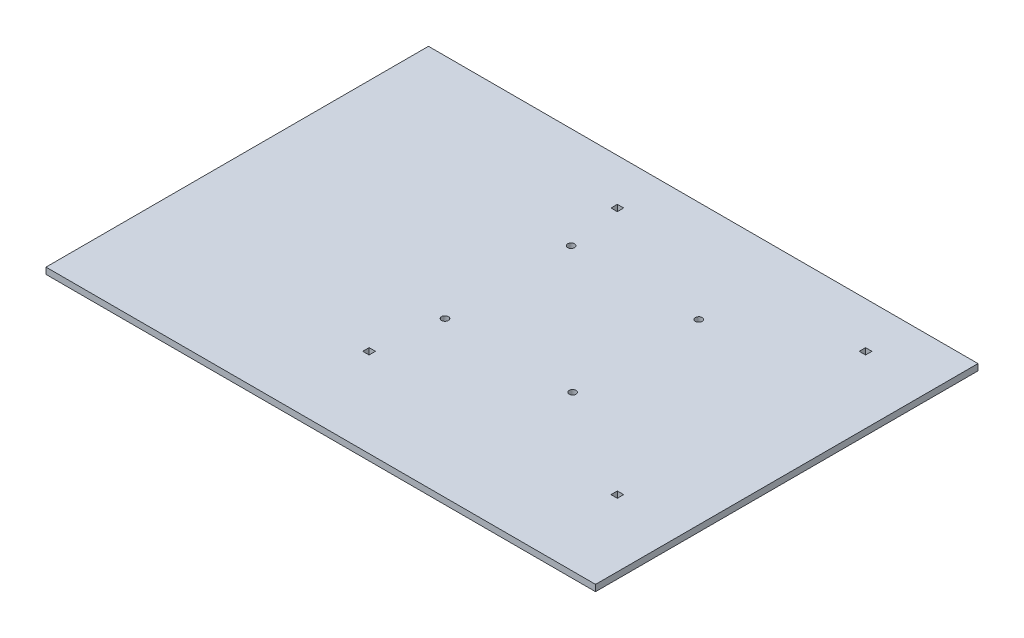
ISO-10303-21;
HEADER;
FILE_DESCRIPTION(('STEP AP214'),'2;1');
FILE_NAME('part.step','',(''),(''),'','','');
FILE_SCHEMA(('AUTOMOTIVE_DESIGN { 1 0 10303 214 1 1 1 1 }'));
ENDSEC;
DATA;
#1=APPLICATION_CONTEXT('core data for automotive mechanical design processes');
#2=APPLICATION_PROTOCOL_DEFINITION('international standard','automotive_design',2000,#1);
#3=PRODUCT_CONTEXT('',#1,'mechanical');
#4=PRODUCT('Part','Part','',(#3));
#5=PRODUCT_RELATED_PRODUCT_CATEGORY('part','',(#4));
#6=PRODUCT_DEFINITION_FORMATION('','',#4);
#7=PRODUCT_DEFINITION_CONTEXT('part definition',#1,'design');
#8=PRODUCT_DEFINITION('design','',#6,#7);
#9=PRODUCT_DEFINITION_SHAPE('','',#8);
#10=(LENGTH_UNIT() NAMED_UNIT(*) SI_UNIT(.MILLI.,.METRE.));
#11=(NAMED_UNIT(*) PLANE_ANGLE_UNIT() SI_UNIT($,.RADIAN.));
#12=(NAMED_UNIT(*) SI_UNIT($,.STERADIAN.) SOLID_ANGLE_UNIT());
#13=UNCERTAINTY_MEASURE_WITH_UNIT(LENGTH_MEASURE(1.E-05),#10,'distance_accuracy_value','');
#14=(GEOMETRIC_REPRESENTATION_CONTEXT(3) GLOBAL_UNCERTAINTY_ASSIGNED_CONTEXT((#13)) GLOBAL_UNIT_ASSIGNED_CONTEXT((#10,
#11,#12)) REPRESENTATION_CONTEXT('',''));
#15=CARTESIAN_POINT('',(0.,0.,0.));
#16=DIRECTION('',(0.,0.,1.));
#17=DIRECTION('',(1.,0.,0.));
#18=AXIS2_PLACEMENT_3D('',#15,#16,#17);
#19=CARTESIAN_POINT('',(0.,0.,0.));
#20=DIRECTION('',(0.,-1.,0.));
#21=DIRECTION('',(0.,0.,-1.));
#22=AXIS2_PLACEMENT_3D('',#19,#20,#21);
#23=PLANE('',#22);
#24=DIRECTION('',(-1.,0.,0.));
#25=VECTOR('',#24,1.);
#26=CARTESIAN_POINT('',(60.,0.,57.));
#27=LINE('',#26,#25);
#28=CARTESIAN_POINT('',(60.,0.,57.));
#29=VERTEX_POINT('',#28);
#30=CARTESIAN_POINT('',(57.,0.,57.));
#31=VERTEX_POINT('',#30);
#32=EDGE_CURVE('E225',#29,#31,#27,.T.);
#33=ORIENTED_EDGE('',*,*,#32,.T.);
#34=DIRECTION('',(0.,0.,-1.));
#35=VECTOR('',#34,1.);
#36=CARTESIAN_POINT('',(57.,0.,60.));
#37=LINE('',#36,#35);
#38=CARTESIAN_POINT('',(57.,0.,60.));
#39=VERTEX_POINT('',#38);
#40=EDGE_CURVE('E238',#39,#31,#37,.T.);
#41=ORIENTED_EDGE('',*,*,#40,.F.);
#42=DIRECTION('',(-1.,0.,0.));
#43=VECTOR('',#42,1.);
#44=CARTESIAN_POINT('',(60.,0.,60.));
#45=LINE('',#44,#43);
#46=CARTESIAN_POINT('',(60.,0.,60.));
#47=VERTEX_POINT('',#46);
#48=EDGE_CURVE('E236',#47,#39,#45,.T.);
#49=ORIENTED_EDGE('',*,*,#48,.F.);
#50=DIRECTION('',(0.,0.,-1.));
#51=VECTOR('',#50,1.);
#52=CARTESIAN_POINT('',(60.,0.,60.));
#53=LINE('',#52,#51);
#54=EDGE_CURVE('E214',#47,#29,#53,.T.);
#55=ORIENTED_EDGE('',*,*,#54,.T.);
#56=EDGE_LOOP('',(#33,#41,#49,#55));
#57=FACE_BOUND('',#56,.T.);
#58=DIRECTION('',(1.,0.,0.));
#59=VECTOR('',#58,1.);
#60=CARTESIAN_POINT('',(-60.,0.,-57.));
#61=LINE('',#60,#59);
#62=CARTESIAN_POINT('',(-60.,0.,-57.));
#63=VERTEX_POINT('',#62);
#64=CARTESIAN_POINT('',(-57.,0.,-57.));
#65=VERTEX_POINT('',#64);
#66=EDGE_CURVE('E270',#63,#65,#61,.T.);
#67=ORIENTED_EDGE('',*,*,#66,.T.);
#68=DIRECTION('',(0.,0.,1.));
#69=VECTOR('',#68,1.);
#70=CARTESIAN_POINT('',(-57.,0.,-60.));
#71=LINE('',#70,#69);
#72=CARTESIAN_POINT('',(-57.,0.,-60.));
#73=VERTEX_POINT('',#72);
#74=EDGE_CURVE('E273',#73,#65,#71,.T.);
#75=ORIENTED_EDGE('',*,*,#74,.F.);
#76=DIRECTION('',(1.,0.,0.));
#77=VECTOR('',#76,1.);
#78=CARTESIAN_POINT('',(-60.,0.,-60.));
#79=LINE('',#78,#77);
#80=CARTESIAN_POINT('',(-60.,0.,-60.));
#81=VERTEX_POINT('',#80);
#82=EDGE_CURVE('E276',#81,#73,#79,.T.);
#83=ORIENTED_EDGE('',*,*,#82,.F.);
#84=DIRECTION('',(0.,0.,1.));
#85=VECTOR('',#84,1.);
#86=CARTESIAN_POINT('',(-60.,0.,-60.));
#87=LINE('',#86,#85);
#88=EDGE_CURVE('E279',#81,#63,#87,.T.);
#89=ORIENTED_EDGE('',*,*,#88,.T.);
#90=EDGE_LOOP('',(#67,#75,#83,#89));
#91=FACE_BOUND('',#90,.T.);
#92=CARTESIAN_POINT('',(6.20000000000003,0.,-32.208579642253));
#93=DIRECTION('',(0.,-1.,0.));
#94=DIRECTION('',(0.,0.,-1.));
#95=AXIS2_PLACEMENT_3D('',#92,#93,#94);
#96=CIRCLE('',#95,1.6);
#97=CARTESIAN_POINT('',(6.20000000000003,0.,-33.808579642253));
#98=VERTEX_POINT('',#97);
#99=EDGE_CURVE('E321',#98,#98,#96,.T.);
#100=ORIENTED_EDGE('',*,*,#99,.F.);
#101=EDGE_LOOP('',(#100));
#102=FACE_BOUND('',#101,.T.);
#103=CARTESIAN_POINT('',(6.20000000000003,0.,27.231420357747));
#104=DIRECTION('',(0.,-1.,0.));
#105=DIRECTION('',(0.,0.,-1.));
#106=AXIS2_PLACEMENT_3D('',#103,#104,#105);
#107=CIRCLE('',#106,1.6);
#108=CARTESIAN_POINT('',(6.20000000000003,0.,25.631420357747));
#109=VERTEX_POINT('',#108);
#110=EDGE_CURVE('E318',#109,#109,#107,.T.);
#111=ORIENTED_EDGE('',*,*,#110,.F.);
#112=EDGE_LOOP('',(#111));
#113=FACE_BOUND('',#112,.T.);
#114=CARTESIAN_POINT('',(-54.,0.,27.231420357747));
#115=DIRECTION('',(0.,-1.,0.));
#116=DIRECTION('',(0.,0.,-1.));
#117=AXIS2_PLACEMENT_3D('',#114,#115,#116);
#118=CIRCLE('',#117,1.6);
#119=CARTESIAN_POINT('',(-54.,0.,25.631420357747));
#120=VERTEX_POINT('',#119);
#121=EDGE_CURVE('E315',#120,#120,#118,.T.);
#122=ORIENTED_EDGE('',*,*,#121,.F.);
#123=EDGE_LOOP('',(#122));
#124=FACE_BOUND('',#123,.T.);
#125=CARTESIAN_POINT('',(-54.,0.,-32.208579642253));
#126=DIRECTION('',(0.,-1.,0.));
#127=DIRECTION('',(0.,0.,-1.));
#128=AXIS2_PLACEMENT_3D('',#125,#126,#127);
#129=CIRCLE('',#128,1.6);
#130=CARTESIAN_POINT('',(-54.,0.,-33.808579642253));
#131=VERTEX_POINT('',#130);
#132=EDGE_CURVE('E312',#131,#131,#129,.T.);
#133=ORIENTED_EDGE('',*,*,#132,.F.);
#134=EDGE_LOOP('',(#133));
#135=FACE_BOUND('',#134,.T.);
#136=DIRECTION('',(-1.,0.,0.));
#137=VECTOR('',#136,1.);
#138=CARTESIAN_POINT('',(-70.,0.,-80.));
#139=LINE('',#138,#137);
#140=CARTESIAN_POINT('',(90.,0.,-80.));
#141=VERTEX_POINT('',#140);
#142=CARTESIAN_POINT('',(-169.021634324675,0.,-80.));
#143=VERTEX_POINT('',#142);
#144=EDGE_CURVE('E39',#141,#143,#139,.T.);
#145=ORIENTED_EDGE('',*,*,#144,.F.);
#146=DIRECTION('',(0.,0.,-1.));
#147=VECTOR('',#146,1.);
#148=CARTESIAN_POINT('',(90.,0.,-80.));
#149=LINE('',#148,#147);
#150=CARTESIAN_POINT('',(90.,0.,100.269434884028));
#151=VERTEX_POINT('',#150);
#152=EDGE_CURVE('E325',#151,#141,#149,.T.);
#153=ORIENTED_EDGE('',*,*,#152,.F.);
#154=DIRECTION('',(1.,0.,0.));
#155=VECTOR('',#154,1.);
#156=CARTESIAN_POINT('',(90.,0.,100.269434884028));
#157=LINE('',#156,#155);
#158=CARTESIAN_POINT('',(-169.021634324675,0.,100.269434884028));
#159=VERTEX_POINT('',#158);
#160=EDGE_CURVE('E332',#159,#151,#157,.T.);
#161=ORIENTED_EDGE('',*,*,#160,.F.);
#162=DIRECTION('',(0.,0.,1.));
#163=VECTOR('',#162,1.);
#164=CARTESIAN_POINT('',(-169.021634324675,0.,-80.));
#165=LINE('',#164,#163);
#166=EDGE_CURVE('E328',#143,#159,#165,.T.);
#167=ORIENTED_EDGE('',*,*,#166,.F.);
#168=EDGE_LOOP('',(#145,#153,#161,#167));
#169=FACE_BOUND('',#168,.T.);
#170=DIRECTION('',(0.,0.,-1.));
#171=VECTOR('',#170,1.);
#172=CARTESIAN_POINT('',(-57.,0.,60.));
#173=LINE('',#172,#171);
#174=CARTESIAN_POINT('',(-57.,0.,60.));
#175=VERTEX_POINT('',#174);
#176=CARTESIAN_POINT('',(-57.,0.,57.));
#177=VERTEX_POINT('',#176);
#178=EDGE_CURVE('E207',#175,#177,#173,.T.);
#179=ORIENTED_EDGE('',*,*,#178,.T.);
#180=DIRECTION('',(1.,0.,0.));
#181=VECTOR('',#180,1.);
#182=CARTESIAN_POINT('',(-60.,0.,57.));
#183=LINE('',#182,#181);
#184=CARTESIAN_POINT('',(-60.,0.,57.));
#185=VERTEX_POINT('',#184);
#186=EDGE_CURVE('E191',#185,#177,#183,.T.);
#187=ORIENTED_EDGE('',*,*,#186,.F.);
#188=DIRECTION('',(0.,0.,-1.));
#189=VECTOR('',#188,1.);
#190=CARTESIAN_POINT('',(-60.,0.,60.));
#191=LINE('',#190,#189);
#192=CARTESIAN_POINT('',(-60.,0.,60.));
#193=VERTEX_POINT('',#192);
#194=EDGE_CURVE('E204',#193,#185,#191,.T.);
#195=ORIENTED_EDGE('',*,*,#194,.F.);
#196=DIRECTION('',(1.,0.,0.));
#197=VECTOR('',#196,1.);
#198=CARTESIAN_POINT('',(-60.,0.,60.));
#199=LINE('',#198,#197);
#200=EDGE_CURVE('E178',#193,#175,#199,.T.);
#201=ORIENTED_EDGE('',*,*,#200,.T.);
#202=EDGE_LOOP('',(#179,#187,#195,#201));
#203=FACE_BOUND('',#202,.T.);
#204=DIRECTION('',(0.,0.,1.));
#205=VECTOR('',#204,1.);
#206=CARTESIAN_POINT('',(57.,0.,-60.));
#207=LINE('',#206,#205);
#208=CARTESIAN_POINT('',(57.,0.,-60.));
#209=VERTEX_POINT('',#208);
#210=CARTESIAN_POINT('',(57.,0.,-57.));
#211=VERTEX_POINT('',#210);
#212=EDGE_CURVE('E266',#209,#211,#207,.T.);
#213=ORIENTED_EDGE('',*,*,#212,.T.);
#214=DIRECTION('',(-1.,0.,0.));
#215=VECTOR('',#214,1.);
#216=CARTESIAN_POINT('',(60.,0.,-57.));
#217=LINE('',#216,#215);
#218=CARTESIAN_POINT('',(60.,0.,-57.));
#219=VERTEX_POINT('',#218);
#220=EDGE_CURVE('E256',#219,#211,#217,.T.);
#221=ORIENTED_EDGE('',*,*,#220,.F.);
#222=DIRECTION('',(0.,0.,1.));
#223=VECTOR('',#222,1.);
#224=CARTESIAN_POINT('',(60.,0.,-60.));
#225=LINE('',#224,#223);
#226=CARTESIAN_POINT('',(60.,0.,-60.));
#227=VERTEX_POINT('',#226);
#228=EDGE_CURVE('E251',#227,#219,#225,.T.);
#229=ORIENTED_EDGE('',*,*,#228,.F.);
#230=DIRECTION('',(-1.,0.,0.));
#231=VECTOR('',#230,1.);
#232=CARTESIAN_POINT('',(60.,0.,-60.));
#233=LINE('',#232,#231);
#234=EDGE_CURVE('E50',#227,#209,#233,.T.);
#235=ORIENTED_EDGE('',*,*,#234,.T.);
#236=EDGE_LOOP('',(#213,#221,#229,#235));
#237=FACE_BOUND('',#236,.T.);
#238=ADVANCED_FACE('F35',(#57,#91,#102,#113,#124,#135,#169,#203,#237),#23,.T.);
#239=CARTESIAN_POINT('',(0.,3.,0.));
#240=DIRECTION('',(0.,-1.,0.));
#241=DIRECTION('',(0.,0.,-1.));
#242=AXIS2_PLACEMENT_3D('',#239,#240,#241);
#243=PLANE('',#242);
#244=DIRECTION('',(1.,0.,0.));
#245=VECTOR('',#244,1.);
#246=CARTESIAN_POINT('',(-60.,3.,57.));
#247=LINE('',#246,#245);
#248=CARTESIAN_POINT('',(-60.,3.,57.));
#249=VERTEX_POINT('',#248);
#250=CARTESIAN_POINT('',(-57.,3.,57.));
#251=VERTEX_POINT('',#250);
#252=EDGE_CURVE('E198',#249,#251,#247,.T.);
#253=ORIENTED_EDGE('',*,*,#252,.T.);
#254=DIRECTION('',(0.,0.,-1.));
#255=VECTOR('',#254,1.);
#256=CARTESIAN_POINT('',(-57.,3.,60.));
#257=LINE('',#256,#255);
#258=CARTESIAN_POINT('',(-57.,3.,60.));
#259=VERTEX_POINT('',#258);
#260=EDGE_CURVE('E196',#259,#251,#257,.T.);
#261=ORIENTED_EDGE('',*,*,#260,.F.);
#262=DIRECTION('',(1.,0.,0.));
#263=VECTOR('',#262,1.);
#264=CARTESIAN_POINT('',(-60.,3.,60.));
#265=LINE('',#264,#263);
#266=CARTESIAN_POINT('',(-60.,3.,60.));
#267=VERTEX_POINT('',#266);
#268=EDGE_CURVE('E175',#267,#259,#265,.T.);
#269=ORIENTED_EDGE('',*,*,#268,.F.);
#270=DIRECTION('',(0.,0.,-1.));
#271=VECTOR('',#270,1.);
#272=CARTESIAN_POINT('',(-60.,3.,60.));
#273=LINE('',#272,#271);
#274=EDGE_CURVE('E186',#267,#249,#273,.T.);
#275=ORIENTED_EDGE('',*,*,#274,.T.);
#276=EDGE_LOOP('',(#253,#261,#269,#275));
#277=FACE_BOUND('',#276,.T.);
#278=DIRECTION('',(0.,0.,1.));
#279=VECTOR('',#278,1.);
#280=CARTESIAN_POINT('',(-57.,3.,-60.));
#281=LINE('',#280,#279);
#282=CARTESIAN_POINT('',(-57.,3.,-60.));
#283=VERTEX_POINT('',#282);
#284=CARTESIAN_POINT('',(-57.,3.,-57.));
#285=VERTEX_POINT('',#284);
#286=EDGE_CURVE('E284',#283,#285,#281,.T.);
#287=ORIENTED_EDGE('',*,*,#286,.T.);
#288=DIRECTION('',(1.,0.,0.));
#289=VECTOR('',#288,1.);
#290=CARTESIAN_POINT('',(-60.,3.,-57.));
#291=LINE('',#290,#289);
#292=CARTESIAN_POINT('',(-60.,3.,-57.));
#293=VERTEX_POINT('',#292);
#294=EDGE_CURVE('E203',#293,#285,#291,.T.);
#295=ORIENTED_EDGE('',*,*,#294,.F.);
#296=DIRECTION('',(0.,0.,1.));
#297=VECTOR('',#296,1.);
#298=CARTESIAN_POINT('',(-60.,3.,-60.));
#299=LINE('',#298,#297);
#300=CARTESIAN_POINT('',(-60.,3.,-60.));
#301=VERTEX_POINT('',#300);
#302=EDGE_CURVE('E274',#301,#293,#299,.T.);
#303=ORIENTED_EDGE('',*,*,#302,.F.);
#304=DIRECTION('',(1.,0.,0.));
#305=VECTOR('',#304,1.);
#306=CARTESIAN_POINT('',(-60.,3.,-60.));
#307=LINE('',#306,#305);
#308=EDGE_CURVE('E287',#301,#283,#307,.T.);
#309=ORIENTED_EDGE('',*,*,#308,.T.);
#310=EDGE_LOOP('',(#287,#295,#303,#309));
#311=FACE_BOUND('',#310,.T.);
#312=DIRECTION('',(0.,0.,1.));
#313=VECTOR('',#312,1.);
#314=CARTESIAN_POINT('',(-169.021634324675,3.,-80.));
#315=LINE('',#314,#313);
#316=CARTESIAN_POINT('',(-169.021634324675,3.,-80.));
#317=VERTEX_POINT('',#316);
#318=CARTESIAN_POINT('',(-169.021634324675,3.,100.269434884028));
#319=VERTEX_POINT('',#318);
#320=EDGE_CURVE('E338',#317,#319,#315,.T.);
#321=ORIENTED_EDGE('',*,*,#320,.T.);
#322=DIRECTION('',(1.,0.,0.));
#323=VECTOR('',#322,1.);
#324=CARTESIAN_POINT('',(90.,3.,100.269434884028));
#325=LINE('',#324,#323);
#326=CARTESIAN_POINT('',(90.,3.,100.269434884028));
#327=VERTEX_POINT('',#326);
#328=EDGE_CURVE('E329',#319,#327,#325,.T.);
#329=ORIENTED_EDGE('',*,*,#328,.T.);
#330=DIRECTION('',(0.,0.,-1.));
#331=VECTOR('',#330,1.);
#332=CARTESIAN_POINT('',(90.,3.,-80.));
#333=LINE('',#332,#331);
#334=CARTESIAN_POINT('',(90.,3.,-80.));
#335=VERTEX_POINT('',#334);
#336=EDGE_CURVE('E324',#327,#335,#333,.T.);
#337=ORIENTED_EDGE('',*,*,#336,.T.);
#338=DIRECTION('',(-1.,0.,0.));
#339=VECTOR('',#338,1.);
#340=CARTESIAN_POINT('',(-70.,3.,-80.));
#341=LINE('',#340,#339);
#342=EDGE_CURVE('E11',#335,#317,#341,.T.);
#343=ORIENTED_EDGE('',*,*,#342,.T.);
#344=EDGE_LOOP('',(#321,#329,#337,#343));
#345=FACE_BOUND('',#344,.T.);
#346=CARTESIAN_POINT('',(6.20000000000003,3.,-32.208579642253));
#347=DIRECTION('',(0.,1.,0.));
#348=DIRECTION('',(0.,0.,1.));
#349=AXIS2_PLACEMENT_3D('',#346,#347,#348);
#350=CIRCLE('',#349,1.6);
#351=CARTESIAN_POINT('',(6.20000000000003,3.,-30.608579642253));
#352=VERTEX_POINT('',#351);
#353=EDGE_CURVE('E294',#352,#352,#350,.T.);
#354=ORIENTED_EDGE('',*,*,#353,.F.);
#355=EDGE_LOOP('',(#354));
#356=FACE_BOUND('',#355,.T.);
#357=CARTESIAN_POINT('',(6.20000000000003,3.,27.231420357747));
#358=DIRECTION('',(0.,1.,0.));
#359=DIRECTION('',(0.,0.,1.));
#360=AXIS2_PLACEMENT_3D('',#357,#358,#359);
#361=CIRCLE('',#360,1.6);
#362=CARTESIAN_POINT('',(6.20000000000003,3.,28.831420357747));
#363=VERTEX_POINT('',#362);
#364=EDGE_CURVE('E305',#363,#363,#361,.T.);
#365=ORIENTED_EDGE('',*,*,#364,.F.);
#366=EDGE_LOOP('',(#365));
#367=FACE_BOUND('',#366,.T.);
#368=CARTESIAN_POINT('',(-54.,3.,27.231420357747));
#369=DIRECTION('',(0.,1.,0.));
#370=DIRECTION('',(0.,0.,1.));
#371=AXIS2_PLACEMENT_3D('',#368,#369,#370);
#372=CIRCLE('',#371,1.6);
#373=CARTESIAN_POINT('',(-54.,3.,28.831420357747));
#374=VERTEX_POINT('',#373);
#375=EDGE_CURVE('E301',#374,#374,#372,.T.);
#376=ORIENTED_EDGE('',*,*,#375,.F.);
#377=EDGE_LOOP('',(#376));
#378=FACE_BOUND('',#377,.T.);
#379=CARTESIAN_POINT('',(-54.,3.,-32.208579642253));
#380=DIRECTION('',(0.,1.,0.));
#381=DIRECTION('',(0.,0.,1.));
#382=AXIS2_PLACEMENT_3D('',#379,#380,#381);
#383=CIRCLE('',#382,1.6);
#384=CARTESIAN_POINT('',(-54.,3.,-30.608579642253));
#385=VERTEX_POINT('',#384);
#386=EDGE_CURVE('E304',#385,#385,#383,.T.);
#387=ORIENTED_EDGE('',*,*,#386,.F.);
#388=EDGE_LOOP('',(#387));
#389=FACE_BOUND('',#388,.T.);
#390=DIRECTION('',(0.,0.,-1.));
#391=VECTOR('',#390,1.);
#392=CARTESIAN_POINT('',(57.,3.,60.));
#393=LINE('',#392,#391);
#394=CARTESIAN_POINT('',(57.,3.,60.));
#395=VERTEX_POINT('',#394);
#396=CARTESIAN_POINT('',(57.,3.,57.));
#397=VERTEX_POINT('',#396);
#398=EDGE_CURVE('E228',#395,#397,#393,.T.);
#399=ORIENTED_EDGE('',*,*,#398,.T.);
#400=DIRECTION('',(-1.,0.,0.));
#401=VECTOR('',#400,1.);
#402=CARTESIAN_POINT('',(60.,3.,57.));
#403=LINE('',#402,#401);
#404=CARTESIAN_POINT('',(60.,3.,57.));
#405=VERTEX_POINT('',#404);
#406=EDGE_CURVE('E231',#405,#397,#403,.T.);
#407=ORIENTED_EDGE('',*,*,#406,.F.);
#408=DIRECTION('',(0.,0.,-1.));
#409=VECTOR('',#408,1.);
#410=CARTESIAN_POINT('',(60.,3.,60.));
#411=LINE('',#410,#409);
#412=CARTESIAN_POINT('',(60.,3.,60.));
#413=VERTEX_POINT('',#412);
#414=EDGE_CURVE('E221',#413,#405,#411,.T.);
#415=ORIENTED_EDGE('',*,*,#414,.F.);
#416=DIRECTION('',(-1.,0.,0.));
#417=VECTOR('',#416,1.);
#418=CARTESIAN_POINT('',(60.,3.,60.));
#419=LINE('',#418,#417);
#420=EDGE_CURVE('E224',#413,#395,#419,.T.);
#421=ORIENTED_EDGE('',*,*,#420,.T.);
#422=EDGE_LOOP('',(#399,#407,#415,#421));
#423=FACE_BOUND('',#422,.T.);
#424=DIRECTION('',(-1.,0.,0.));
#425=VECTOR('',#424,1.);
#426=CARTESIAN_POINT('',(60.,3.,-57.));
#427=LINE('',#426,#425);
#428=CARTESIAN_POINT('',(60.,3.,-57.));
#429=VERTEX_POINT('',#428);
#430=CARTESIAN_POINT('',(57.,3.,-57.));
#431=VERTEX_POINT('',#430);
#432=EDGE_CURVE('E220',#429,#431,#427,.T.);
#433=ORIENTED_EDGE('',*,*,#432,.T.);
#434=DIRECTION('',(0.,0.,1.));
#435=VECTOR('',#434,1.);
#436=CARTESIAN_POINT('',(57.,3.,-60.));
#437=LINE('',#436,#435);
#438=CARTESIAN_POINT('',(57.,3.,-60.));
#439=VERTEX_POINT('',#438);
#440=EDGE_CURVE('E259',#439,#431,#437,.T.);
#441=ORIENTED_EDGE('',*,*,#440,.F.);
#442=DIRECTION('',(-1.,0.,0.));
#443=VECTOR('',#442,1.);
#444=CARTESIAN_POINT('',(60.,3.,-60.));
#445=LINE('',#444,#443);
#446=CARTESIAN_POINT('',(60.,3.,-60.));
#447=VERTEX_POINT('',#446);
#448=EDGE_CURVE('E255',#447,#439,#445,.T.);
#449=ORIENTED_EDGE('',*,*,#448,.F.);
#450=DIRECTION('',(0.,0.,1.));
#451=VECTOR('',#450,1.);
#452=CARTESIAN_POINT('',(60.,3.,-60.));
#453=LINE('',#452,#451);
#454=EDGE_CURVE('E252',#447,#429,#453,.T.);
#455=ORIENTED_EDGE('',*,*,#454,.T.);
#456=EDGE_LOOP('',(#433,#441,#449,#455));
#457=FACE_BOUND('',#456,.T.);
#458=ADVANCED_FACE('F193',(#277,#311,#345,#356,#367,#378,#389,#423,#457),#243,.F.);
#459=CARTESIAN_POINT('',(-70.,3.,-80.));
#460=DIRECTION('',(0.,0.,1.));
#461=DIRECTION('',(1.,0.,0.));
#462=AXIS2_PLACEMENT_3D('',#459,#460,#461);
#463=PLANE('',#462);
#464=ORIENTED_EDGE('',*,*,#144,.T.);
#465=DIRECTION('',(0.,1.,0.));
#466=VECTOR('',#465,1.);
#467=CARTESIAN_POINT('',(-169.021634324675,0.,-80.));
#468=LINE('',#467,#466);
#469=EDGE_CURVE('E347',#143,#317,#468,.T.);
#470=ORIENTED_EDGE('',*,*,#469,.T.);
#471=ORIENTED_EDGE('',*,*,#342,.F.);
#472=DIRECTION('',(0.,1.,0.));
#473=VECTOR('',#472,1.);
#474=CARTESIAN_POINT('',(90.,0.,-80.));
#475=LINE('',#474,#473);
#476=EDGE_CURVE('E335',#141,#335,#475,.T.);
#477=ORIENTED_EDGE('',*,*,#476,.F.);
#478=EDGE_LOOP('',(#464,#470,#471,#477));
#479=FACE_BOUND('',#478,.T.);
#480=ADVANCED_FACE('F37',(#479),#463,.F.);
#481=CARTESIAN_POINT('',(90.,0.,-80.));
#482=DIRECTION('',(1.,0.,0.));
#483=DIRECTION('',(0.,0.,-1.));
#484=AXIS2_PLACEMENT_3D('',#481,#482,#483);
#485=PLANE('',#484);
#486=ORIENTED_EDGE('',*,*,#336,.F.);
#487=DIRECTION('',(0.,1.,0.));
#488=VECTOR('',#487,1.);
#489=CARTESIAN_POINT('',(90.,0.,100.269434884028));
#490=LINE('',#489,#488);
#491=EDGE_CURVE('E342',#151,#327,#490,.T.);
#492=ORIENTED_EDGE('',*,*,#491,.F.);
#493=ORIENTED_EDGE('',*,*,#152,.T.);
#494=ORIENTED_EDGE('',*,*,#476,.T.);
#495=EDGE_LOOP('',(#486,#492,#493,#494));
#496=FACE_BOUND('',#495,.T.);
#497=ADVANCED_FACE('F354',(#496),#485,.T.);
#498=CARTESIAN_POINT('',(90.,0.,100.269434884028));
#499=DIRECTION('',(0.,0.,1.));
#500=DIRECTION('',(1.,0.,0.));
#501=AXIS2_PLACEMENT_3D('',#498,#499,#500);
#502=PLANE('',#501);
#503=ORIENTED_EDGE('',*,*,#328,.F.);
#504=DIRECTION('',(0.,1.,0.));
#505=VECTOR('',#504,1.);
#506=CARTESIAN_POINT('',(-169.021634324675,0.,100.269434884028));
#507=LINE('',#506,#505);
#508=EDGE_CURVE('E344',#159,#319,#507,.T.);
#509=ORIENTED_EDGE('',*,*,#508,.F.);
#510=ORIENTED_EDGE('',*,*,#160,.T.);
#511=ORIENTED_EDGE('',*,*,#491,.T.);
#512=EDGE_LOOP('',(#503,#509,#510,#511));
#513=FACE_BOUND('',#512,.T.);
#514=ADVANCED_FACE('F362',(#513),#502,.T.);
#515=CARTESIAN_POINT('',(-169.021634324675,0.,-80.));
#516=DIRECTION('',(-1.,0.,0.));
#517=DIRECTION('',(0.,0.,1.));
#518=AXIS2_PLACEMENT_3D('',#515,#516,#517);
#519=PLANE('',#518);
#520=ORIENTED_EDGE('',*,*,#320,.F.);
#521=ORIENTED_EDGE('',*,*,#469,.F.);
#522=ORIENTED_EDGE('',*,*,#166,.T.);
#523=ORIENTED_EDGE('',*,*,#508,.T.);
#524=EDGE_LOOP('',(#520,#521,#522,#523));
#525=FACE_BOUND('',#524,.T.);
#526=ADVANCED_FACE('F369',(#525),#519,.T.);
#527=CARTESIAN_POINT('',(-54.,-7.,-32.208579642253));
#528=DIRECTION('',(0.,1.,0.));
#529=DIRECTION('',(0.,0.,1.));
#530=AXIS2_PLACEMENT_3D('',#527,#528,#529);
#531=CYLINDRICAL_SURFACE('',#530,1.6);
#532=ORIENTED_EDGE('',*,*,#132,.T.);
#533=EDGE_LOOP('',(#532));
#534=FACE_BOUND('',#533,.T.);
#535=ORIENTED_EDGE('',*,*,#386,.T.);
#536=EDGE_LOOP('',(#535));
#537=FACE_BOUND('',#536,.T.);
#538=ADVANCED_FACE('F371',(#534,#537),#531,.F.);
#539=CARTESIAN_POINT('',(-54.,-7.,27.231420357747));
#540=DIRECTION('',(0.,1.,0.));
#541=DIRECTION('',(0.,0.,1.));
#542=AXIS2_PLACEMENT_3D('',#539,#540,#541);
#543=CYLINDRICAL_SURFACE('',#542,1.6);
#544=ORIENTED_EDGE('',*,*,#121,.T.);
#545=EDGE_LOOP('',(#544));
#546=FACE_BOUND('',#545,.T.);
#547=ORIENTED_EDGE('',*,*,#375,.T.);
#548=EDGE_LOOP('',(#547));
#549=FACE_BOUND('',#548,.T.);
#550=ADVANCED_FACE('F377',(#546,#549),#543,.F.);
#551=CARTESIAN_POINT('',(6.20000000000003,-7.,27.231420357747));
#552=DIRECTION('',(0.,1.,0.));
#553=DIRECTION('',(0.,0.,1.));
#554=AXIS2_PLACEMENT_3D('',#551,#552,#553);
#555=CYLINDRICAL_SURFACE('',#554,1.6);
#556=ORIENTED_EDGE('',*,*,#110,.T.);
#557=EDGE_LOOP('',(#556));
#558=FACE_BOUND('',#557,.T.);
#559=ORIENTED_EDGE('',*,*,#364,.T.);
#560=EDGE_LOOP('',(#559));
#561=FACE_BOUND('',#560,.T.);
#562=ADVANCED_FACE('F567',(#558,#561),#555,.F.);
#563=CARTESIAN_POINT('',(6.20000000000003,-7.,-32.208579642253));
#564=DIRECTION('',(0.,1.,0.));
#565=DIRECTION('',(0.,0.,1.));
#566=AXIS2_PLACEMENT_3D('',#563,#564,#565);
#567=CYLINDRICAL_SURFACE('',#566,1.6);
#568=ORIENTED_EDGE('',*,*,#99,.T.);
#569=EDGE_LOOP('',(#568));
#570=FACE_BOUND('',#569,.T.);
#571=ORIENTED_EDGE('',*,*,#353,.T.);
#572=EDGE_LOOP('',(#571));
#573=FACE_BOUND('',#572,.T.);
#574=ADVANCED_FACE('F414',(#570,#573),#567,.F.);
#575=CARTESIAN_POINT('',(-60.,0.,-57.));
#576=DIRECTION('',(0.,0.,1.));
#577=DIRECTION('',(1.,0.,0.));
#578=AXIS2_PLACEMENT_3D('',#575,#576,#577);
#579=PLANE('',#578);
#580=ORIENTED_EDGE('',*,*,#294,.T.);
#581=DIRECTION('',(0.,1.,0.));
#582=VECTOR('',#581,1.);
#583=CARTESIAN_POINT('',(-57.,0.,-57.));
#584=LINE('',#583,#582);
#585=EDGE_CURVE('E282',#65,#285,#584,.T.);
#586=ORIENTED_EDGE('',*,*,#585,.F.);
#587=ORIENTED_EDGE('',*,*,#66,.F.);
#588=DIRECTION('',(0.,1.,0.));
#589=VECTOR('',#588,1.);
#590=CARTESIAN_POINT('',(-60.,0.,-57.));
#591=LINE('',#590,#589);
#592=EDGE_CURVE('E292',#63,#293,#591,.T.);
#593=ORIENTED_EDGE('',*,*,#592,.T.);
#594=EDGE_LOOP('',(#580,#586,#587,#593));
#595=FACE_BOUND('',#594,.T.);
#596=ADVANCED_FACE('F408',(#595),#579,.F.);
#597=CARTESIAN_POINT('',(-60.,0.,-60.));
#598=DIRECTION('',(-1.,0.,0.));
#599=DIRECTION('',(0.,0.,1.));
#600=AXIS2_PLACEMENT_3D('',#597,#598,#599);
#601=PLANE('',#600);
#602=ORIENTED_EDGE('',*,*,#302,.T.);
#603=ORIENTED_EDGE('',*,*,#592,.F.);
#604=ORIENTED_EDGE('',*,*,#88,.F.);
#605=DIRECTION('',(0.,1.,0.));
#606=VECTOR('',#605,1.);
#607=CARTESIAN_POINT('',(-60.,0.,-60.));
#608=LINE('',#607,#606);
#609=EDGE_CURVE('E295',#81,#301,#608,.T.);
#610=ORIENTED_EDGE('',*,*,#609,.T.);
#611=EDGE_LOOP('',(#602,#603,#604,#610));
#612=FACE_BOUND('',#611,.T.);
#613=ADVANCED_FACE('F413',(#612),#601,.F.);
#614=CARTESIAN_POINT('',(-60.,0.,-60.));
#615=DIRECTION('',(0.,0.,1.));
#616=DIRECTION('',(1.,0.,0.));
#617=AXIS2_PLACEMENT_3D('',#614,#615,#616);
#618=PLANE('',#617);
#619=ORIENTED_EDGE('',*,*,#308,.F.);
#620=ORIENTED_EDGE('',*,*,#609,.F.);
#621=ORIENTED_EDGE('',*,*,#82,.T.);
#622=DIRECTION('',(0.,1.,0.));
#623=VECTOR('',#622,1.);
#624=CARTESIAN_POINT('',(-57.,0.,-60.));
#625=LINE('',#624,#623);
#626=EDGE_CURVE('E297',#73,#283,#625,.T.);
#627=ORIENTED_EDGE('',*,*,#626,.T.);
#628=EDGE_LOOP('',(#619,#620,#621,#627));
#629=FACE_BOUND('',#628,.T.);
#630=ADVANCED_FACE('F425',(#629),#618,.T.);
#631=CARTESIAN_POINT('',(-57.,0.,-60.));
#632=DIRECTION('',(-1.,0.,0.));
#633=DIRECTION('',(0.,0.,1.));
#634=AXIS2_PLACEMENT_3D('',#631,#632,#633);
#635=PLANE('',#634);
#636=ORIENTED_EDGE('',*,*,#286,.F.);
#637=ORIENTED_EDGE('',*,*,#626,.F.);
#638=ORIENTED_EDGE('',*,*,#74,.T.);
#639=ORIENTED_EDGE('',*,*,#585,.T.);
#640=EDGE_LOOP('',(#636,#637,#638,#639));
#641=FACE_BOUND('',#640,.T.);
#642=ADVANCED_FACE('F435',(#641),#635,.T.);
#643=CARTESIAN_POINT('',(-60.,0.,57.));
#644=DIRECTION('',(0.,0.,1.));
#645=DIRECTION('',(1.,0.,0.));
#646=AXIS2_PLACEMENT_3D('',#643,#644,#645);
#647=PLANE('',#646);
#648=ORIENTED_EDGE('',*,*,#252,.F.);
#649=DIRECTION('',(0.,1.,0.));
#650=VECTOR('',#649,1.);
#651=CARTESIAN_POINT('',(-60.,0.,57.));
#652=LINE('',#651,#650);
#653=EDGE_CURVE('E181',#185,#249,#652,.T.);
#654=ORIENTED_EDGE('',*,*,#653,.F.);
#655=ORIENTED_EDGE('',*,*,#186,.T.);
#656=DIRECTION('',(0.,1.,0.));
#657=VECTOR('',#656,1.);
#658=CARTESIAN_POINT('',(-57.,0.,57.));
#659=LINE('',#658,#657);
#660=EDGE_CURVE('E233',#177,#251,#659,.T.);
#661=ORIENTED_EDGE('',*,*,#660,.T.);
#662=EDGE_LOOP('',(#648,#654,#655,#661));
#663=FACE_BOUND('',#662,.T.);
#664=ADVANCED_FACE('F445',(#663),#647,.T.);
#665=CARTESIAN_POINT('',(-57.,0.,60.));
#666=DIRECTION('',(1.,0.,0.));
#667=DIRECTION('',(0.,0.,-1.));
#668=AXIS2_PLACEMENT_3D('',#665,#666,#667);
#669=PLANE('',#668);
#670=ORIENTED_EDGE('',*,*,#260,.T.);
#671=ORIENTED_EDGE('',*,*,#660,.F.);
#672=ORIENTED_EDGE('',*,*,#178,.F.);
#673=DIRECTION('',(0.,1.,0.));
#674=VECTOR('',#673,1.);
#675=CARTESIAN_POINT('',(-57.,0.,60.));
#676=LINE('',#675,#674);
#677=EDGE_CURVE('E182',#175,#259,#676,.T.);
#678=ORIENTED_EDGE('',*,*,#677,.T.);
#679=EDGE_LOOP('',(#670,#671,#672,#678));
#680=FACE_BOUND('',#679,.T.);
#681=ADVANCED_FACE('F455',(#680),#669,.F.);
#682=CARTESIAN_POINT('',(-60.,0.,60.));
#683=DIRECTION('',(0.,0.,1.));
#684=DIRECTION('',(1.,0.,0.));
#685=AXIS2_PLACEMENT_3D('',#682,#683,#684);
#686=PLANE('',#685);
#687=ORIENTED_EDGE('',*,*,#268,.T.);
#688=ORIENTED_EDGE('',*,*,#677,.F.);
#689=ORIENTED_EDGE('',*,*,#200,.F.);
#690=DIRECTION('',(0.,1.,0.));
#691=VECTOR('',#690,1.);
#692=CARTESIAN_POINT('',(-60.,0.,60.));
#693=LINE('',#692,#691);
#694=EDGE_CURVE('E171',#193,#267,#693,.T.);
#695=ORIENTED_EDGE('',*,*,#694,.T.);
#696=EDGE_LOOP('',(#687,#688,#689,#695));
#697=FACE_BOUND('',#696,.T.);
#698=ADVANCED_FACE('F173',(#697),#686,.F.);
#699=CARTESIAN_POINT('',(-60.,0.,60.));
#700=DIRECTION('',(1.,0.,0.));
#701=DIRECTION('',(0.,0.,-1.));
#702=AXIS2_PLACEMENT_3D('',#699,#700,#701);
#703=PLANE('',#702);
#704=ORIENTED_EDGE('',*,*,#274,.F.);
#705=ORIENTED_EDGE('',*,*,#694,.F.);
#706=ORIENTED_EDGE('',*,*,#194,.T.);
#707=ORIENTED_EDGE('',*,*,#653,.T.);
#708=EDGE_LOOP('',(#704,#705,#706,#707));
#709=FACE_BOUND('',#708,.T.);
#710=ADVANCED_FACE('F187',(#709),#703,.T.);
#711=CARTESIAN_POINT('',(60.,0.,57.));
#712=DIRECTION('',(0.,0.,-1.));
#713=DIRECTION('',(-1.,0.,0.));
#714=AXIS2_PLACEMENT_3D('',#711,#712,#713);
#715=PLANE('',#714);
#716=ORIENTED_EDGE('',*,*,#406,.T.);
#717=DIRECTION('',(0.,1.,0.));
#718=VECTOR('',#717,1.);
#719=CARTESIAN_POINT('',(57.,0.,57.));
#720=LINE('',#719,#718);
#721=EDGE_CURVE('E211',#31,#397,#720,.T.);
#722=ORIENTED_EDGE('',*,*,#721,.F.);
#723=ORIENTED_EDGE('',*,*,#32,.F.);
#724=DIRECTION('',(0.,1.,0.));
#725=VECTOR('',#724,1.);
#726=CARTESIAN_POINT('',(60.,0.,57.));
#727=LINE('',#726,#725);
#728=EDGE_CURVE('E218',#29,#405,#727,.T.);
#729=ORIENTED_EDGE('',*,*,#728,.T.);
#730=EDGE_LOOP('',(#716,#722,#723,#729));
#731=FACE_BOUND('',#730,.T.);
#732=ADVANCED_FACE('F482',(#731),#715,.F.);
#733=CARTESIAN_POINT('',(60.,0.,60.));
#734=DIRECTION('',(1.,0.,0.));
#735=DIRECTION('',(0.,0.,-1.));
#736=AXIS2_PLACEMENT_3D('',#733,#734,#735);
#737=PLANE('',#736);
#738=ORIENTED_EDGE('',*,*,#414,.T.);
#739=ORIENTED_EDGE('',*,*,#728,.F.);
#740=ORIENTED_EDGE('',*,*,#54,.F.);
#741=DIRECTION('',(0.,1.,0.));
#742=VECTOR('',#741,1.);
#743=CARTESIAN_POINT('',(60.,0.,60.));
#744=LINE('',#743,#742);
#745=EDGE_CURVE('E216',#47,#413,#744,.T.);
#746=ORIENTED_EDGE('',*,*,#745,.T.);
#747=EDGE_LOOP('',(#738,#739,#740,#746));
#748=FACE_BOUND('',#747,.T.);
#749=ADVANCED_FACE('F491',(#748),#737,.F.);
#750=CARTESIAN_POINT('',(60.,0.,60.));
#751=DIRECTION('',(0.,0.,-1.));
#752=DIRECTION('',(-1.,0.,0.));
#753=AXIS2_PLACEMENT_3D('',#750,#751,#752);
#754=PLANE('',#753);
#755=ORIENTED_EDGE('',*,*,#420,.F.);
#756=ORIENTED_EDGE('',*,*,#745,.F.);
#757=ORIENTED_EDGE('',*,*,#48,.T.);
#758=DIRECTION('',(0.,1.,0.));
#759=VECTOR('',#758,1.);
#760=CARTESIAN_POINT('',(57.,0.,60.));
#761=LINE('',#760,#759);
#762=EDGE_CURVE('E58',#39,#395,#761,.T.);
#763=ORIENTED_EDGE('',*,*,#762,.T.);
#764=EDGE_LOOP('',(#755,#756,#757,#763));
#765=FACE_BOUND('',#764,.T.);
#766=ADVANCED_FACE('F501',(#765),#754,.T.);
#767=CARTESIAN_POINT('',(57.,0.,60.));
#768=DIRECTION('',(1.,0.,0.));
#769=DIRECTION('',(0.,0.,-1.));
#770=AXIS2_PLACEMENT_3D('',#767,#768,#769);
#771=PLANE('',#770);
#772=ORIENTED_EDGE('',*,*,#398,.F.);
#773=ORIENTED_EDGE('',*,*,#762,.F.);
#774=ORIENTED_EDGE('',*,*,#40,.T.);
#775=ORIENTED_EDGE('',*,*,#721,.T.);
#776=EDGE_LOOP('',(#772,#773,#774,#775));
#777=FACE_BOUND('',#776,.T.);
#778=ADVANCED_FACE('F511',(#777),#771,.T.);
#779=CARTESIAN_POINT('',(60.,0.,-57.));
#780=DIRECTION('',(0.,0.,-1.));
#781=DIRECTION('',(-1.,0.,0.));
#782=AXIS2_PLACEMENT_3D('',#779,#780,#781);
#783=PLANE('',#782);
#784=ORIENTED_EDGE('',*,*,#432,.F.);
#785=DIRECTION('',(0.,1.,0.));
#786=VECTOR('',#785,1.);
#787=CARTESIAN_POINT('',(60.,0.,-57.));
#788=LINE('',#787,#786);
#789=EDGE_CURVE('E248',#219,#429,#788,.T.);
#790=ORIENTED_EDGE('',*,*,#789,.F.);
#791=ORIENTED_EDGE('',*,*,#220,.T.);
#792=DIRECTION('',(0.,1.,0.));
#793=VECTOR('',#792,1.);
#794=CARTESIAN_POINT('',(57.,0.,-57.));
#795=LINE('',#794,#793);
#796=EDGE_CURVE('E242',#211,#431,#795,.T.);
#797=ORIENTED_EDGE('',*,*,#796,.T.);
#798=EDGE_LOOP('',(#784,#790,#791,#797));
#799=FACE_BOUND('',#798,.T.);
#800=ADVANCED_FACE('F521',(#799),#783,.T.);
#801=CARTESIAN_POINT('',(57.,0.,-60.));
#802=DIRECTION('',(-1.,0.,0.));
#803=DIRECTION('',(0.,0.,1.));
#804=AXIS2_PLACEMENT_3D('',#801,#802,#803);
#805=PLANE('',#804);
#806=ORIENTED_EDGE('',*,*,#440,.T.);
#807=ORIENTED_EDGE('',*,*,#796,.F.);
#808=ORIENTED_EDGE('',*,*,#212,.F.);
#809=DIRECTION('',(0.,1.,0.));
#810=VECTOR('',#809,1.);
#811=CARTESIAN_POINT('',(57.,0.,-60.));
#812=LINE('',#811,#810);
#813=EDGE_CURVE('E244',#209,#439,#812,.T.);
#814=ORIENTED_EDGE('',*,*,#813,.T.);
#815=EDGE_LOOP('',(#806,#807,#808,#814));
#816=FACE_BOUND('',#815,.T.);
#817=ADVANCED_FACE('F530',(#816),#805,.F.);
#818=CARTESIAN_POINT('',(60.,0.,-60.));
#819=DIRECTION('',(0.,0.,-1.));
#820=DIRECTION('',(-1.,0.,0.));
#821=AXIS2_PLACEMENT_3D('',#818,#819,#820);
#822=PLANE('',#821);
#823=ORIENTED_EDGE('',*,*,#448,.T.);
#824=ORIENTED_EDGE('',*,*,#813,.F.);
#825=ORIENTED_EDGE('',*,*,#234,.F.);
#826=DIRECTION('',(0.,1.,0.));
#827=VECTOR('',#826,1.);
#828=CARTESIAN_POINT('',(60.,0.,-60.));
#829=LINE('',#828,#827);
#830=EDGE_CURVE('E246',#227,#447,#829,.T.);
#831=ORIENTED_EDGE('',*,*,#830,.T.);
#832=EDGE_LOOP('',(#823,#824,#825,#831));
#833=FACE_BOUND('',#832,.T.);
#834=ADVANCED_FACE('F540',(#833),#822,.F.);
#835=CARTESIAN_POINT('',(60.,0.,-60.));
#836=DIRECTION('',(-1.,0.,0.));
#837=DIRECTION('',(0.,0.,1.));
#838=AXIS2_PLACEMENT_3D('',#835,#836,#837);
#839=PLANE('',#838);
#840=ORIENTED_EDGE('',*,*,#454,.F.);
#841=ORIENTED_EDGE('',*,*,#830,.F.);
#842=ORIENTED_EDGE('',*,*,#228,.T.);
#843=ORIENTED_EDGE('',*,*,#789,.T.);
#844=EDGE_LOOP('',(#840,#841,#842,#843));
#845=FACE_BOUND('',#844,.T.);
#846=ADVANCED_FACE('F550',(#845),#839,.T.);
#847=CLOSED_SHELL('',(#238,#458,#480,#497,#514,#526,#538,#550,#562,#574,#596,#613,#630,#642,
#664,#681,#698,#710,#732,#749,#766,#778,#800,#817,#834,#846));
#848=MANIFOLD_SOLID_BREP('B2',#847);
#849=ADVANCED_BREP_SHAPE_REPRESENTATION('',(#18,#848),#14);
#850=SHAPE_DEFINITION_REPRESENTATION(#9,#849);
ENDSEC;
END-ISO-10303-21;
